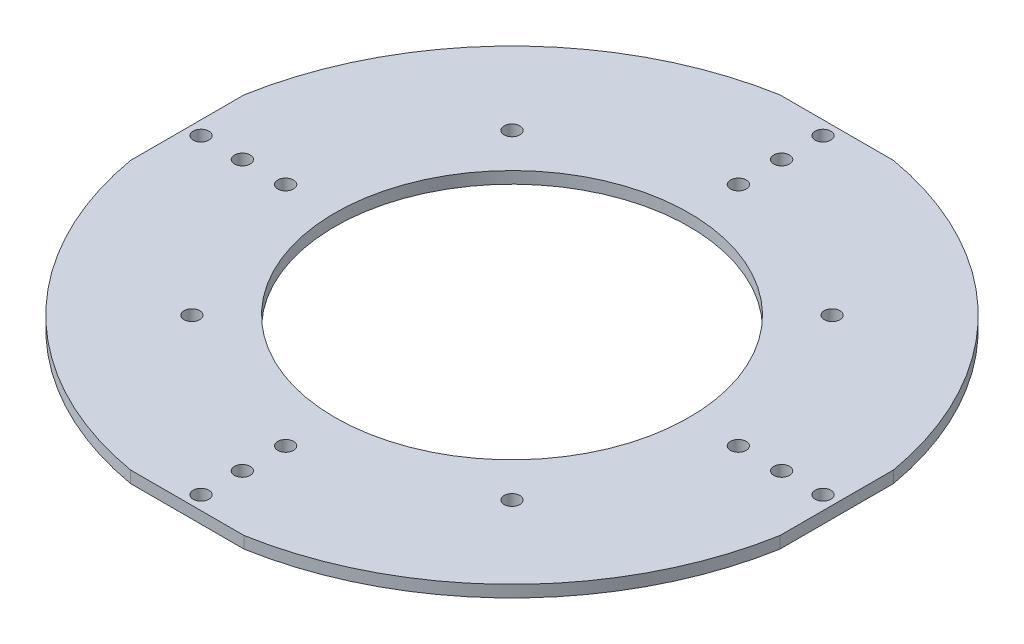
ISO-10303-21;
HEADER;
FILE_DESCRIPTION(('STEP AP214'),'2;1');
FILE_NAME('part.step','',(''),(''),'','','');
FILE_SCHEMA(('AUTOMOTIVE_DESIGN { 1 0 10303 214 1 1 1 1 }'));
ENDSEC;
DATA;
#1=APPLICATION_CONTEXT('core data for automotive mechanical design processes');
#2=APPLICATION_PROTOCOL_DEFINITION('international standard','automotive_design',2000,#1);
#3=PRODUCT_CONTEXT('',#1,'mechanical');
#4=PRODUCT('Part','Part','',(#3));
#5=PRODUCT_RELATED_PRODUCT_CATEGORY('part','',(#4));
#6=PRODUCT_DEFINITION_FORMATION('','',#4);
#7=PRODUCT_DEFINITION_CONTEXT('part definition',#1,'design');
#8=PRODUCT_DEFINITION('design','',#6,#7);
#9=PRODUCT_DEFINITION_SHAPE('','',#8);
#10=(LENGTH_UNIT() NAMED_UNIT(*) SI_UNIT(.MILLI.,.METRE.));
#11=(NAMED_UNIT(*) PLANE_ANGLE_UNIT() SI_UNIT($,.RADIAN.));
#12=(NAMED_UNIT(*) SI_UNIT($,.STERADIAN.) SOLID_ANGLE_UNIT());
#13=UNCERTAINTY_MEASURE_WITH_UNIT(LENGTH_MEASURE(1.E-05),#10,'distance_accuracy_value','');
#14=(GEOMETRIC_REPRESENTATION_CONTEXT(3) GLOBAL_UNCERTAINTY_ASSIGNED_CONTEXT((#13)) GLOBAL_UNIT_ASSIGNED_CONTEXT((#10,
#11,#12)) REPRESENTATION_CONTEXT('',''));
#15=CARTESIAN_POINT('',(0.,0.,0.));
#16=DIRECTION('',(0.,0.,1.));
#17=DIRECTION('',(1.,0.,0.));
#18=AXIS2_PLACEMENT_3D('',#15,#16,#17);
#19=CARTESIAN_POINT('',(0.,6.,0.));
#20=DIRECTION('',(0.,1.,0.));
#21=DIRECTION('',(0.,0.,1.));
#22=AXIS2_PLACEMENT_3D('',#19,#20,#21);
#23=PLANE('',#22);
#24=CARTESIAN_POINT('',(-114.999999999995,6.,4.89538964920655E-12));
#25=DIRECTION('',(0.,1.,0.));
#26=DIRECTION('',(0.,0.,1.));
#27=AXIS2_PLACEMENT_3D('',#24,#25,#26);
#28=CIRCLE('',#27,4.00000000000726);
#29=CARTESIAN_POINT('',(-114.999999999995,6.,4.00000000001216));
#30=VERTEX_POINT('',#29);
#31=EDGE_CURVE('E248',#30,#30,#28,.T.);
#32=ORIENTED_EDGE('',*,*,#31,.F.);
#33=EDGE_LOOP('',(#32));
#34=FACE_BOUND('',#33,.T.);
#35=CARTESIAN_POINT('',(9.76302372279747E-12,6.,115.));
#36=DIRECTION('',(0.,1.,0.));
#37=DIRECTION('',(0.,0.,1.));
#38=AXIS2_PLACEMENT_3D('',#35,#36,#37);
#39=CIRCLE('',#38,4.00000000001011);
#40=CARTESIAN_POINT('',(9.76302372279747E-12,6.,119.00000000001));
#41=VERTEX_POINT('',#40);
#42=EDGE_CURVE('E236',#41,#41,#39,.T.);
#43=ORIENTED_EDGE('',*,*,#42,.F.);
#44=EDGE_LOOP('',(#43));
#45=FACE_BOUND('',#44,.T.);
#46=CARTESIAN_POINT('',(1.64313007644523E-11,6.,158.));
#47=DIRECTION('',(0.,1.,0.));
#48=DIRECTION('',(0.,0.,1.));
#49=AXIS2_PLACEMENT_3D('',#46,#47,#48);
#50=CIRCLE('',#49,4.00000000000875);
#51=CARTESIAN_POINT('',(1.64313007644523E-11,6.,162.000000000009));
#52=VERTEX_POINT('',#51);
#53=EDGE_CURVE('E224',#52,#52,#50,.T.);
#54=ORIENTED_EDGE('',*,*,#53,.F.);
#55=EDGE_LOOP('',(#54));
#56=FACE_BOUND('',#55,.T.);
#57=CARTESIAN_POINT('',(137.,6.,-1.64472998402501E-11));
#58=DIRECTION('',(0.,1.,0.));
#59=DIRECTION('',(0.,0.,1.));
#60=AXIS2_PLACEMENT_3D('',#57,#58,#59);
#61=CIRCLE('',#60,4.00000000000858);
#62=CARTESIAN_POINT('',(137.,6.,3.99999999999214));
#63=VERTEX_POINT('',#62);
#64=EDGE_CURVE('E212',#63,#63,#61,.T.);
#65=ORIENTED_EDGE('',*,*,#64,.F.);
#66=EDGE_LOOP('',(#65));
#67=FACE_BOUND('',#66,.T.);
#68=CARTESIAN_POINT('',(-1.64341523222281E-11,6.,-137.));
#69=DIRECTION('',(0.,1.,0.));
#70=DIRECTION('',(0.,0.,1.));
#71=AXIS2_PLACEMENT_3D('',#68,#69,#70);
#72=CIRCLE('',#71,4.00000000000855);
#73=CARTESIAN_POINT('',(-1.64341523222281E-11,6.,-132.999999999991));
#74=VERTEX_POINT('',#73);
#75=EDGE_CURVE('E200',#74,#74,#72,.T.);
#76=ORIENTED_EDGE('',*,*,#75,.F.);
#77=EDGE_LOOP('',(#76));
#78=FACE_BOUND('',#77,.T.);
#79=CARTESIAN_POINT('',(115.000000000005,6.,-4.88151186139874E-12));
#80=DIRECTION('',(0.,1.,0.));
#81=DIRECTION('',(0.,0.,1.));
#82=AXIS2_PLACEMENT_3D('',#79,#80,#81);
#83=CIRCLE('',#82,4.00000000000362);
#84=CARTESIAN_POINT('',(115.000000000005,6.,3.99999999999874));
#85=VERTEX_POINT('',#84);
#86=EDGE_CURVE('E188',#85,#85,#83,.T.);
#87=ORIENTED_EDGE('',*,*,#86,.F.);
#88=EDGE_LOOP('',(#87));
#89=FACE_BOUND('',#88,.T.);
#90=CARTESIAN_POINT('',(-137.,6.,1.64305221791017E-11));
#91=DIRECTION('',(0.,1.,0.));
#92=DIRECTION('',(0.,0.,1.));
#93=AXIS2_PLACEMENT_3D('',#90,#91,#92);
#94=CIRCLE('',#93,4.00000000000861);
#95=CARTESIAN_POINT('',(-137.,6.,4.00000000002504));
#96=VERTEX_POINT('',#95);
#97=EDGE_CURVE('E176',#96,#96,#94,.T.);
#98=ORIENTED_EDGE('',*,*,#97,.F.);
#99=EDGE_LOOP('',(#98));
#100=FACE_BOUND('',#99,.T.);
#101=CARTESIAN_POINT('',(0.,6.,0.));
#102=DIRECTION('',(0.,1.,0.));
#103=DIRECTION('',(0.,0.,1.));
#104=AXIS2_PLACEMENT_3D('',#101,#102,#103);
#105=CIRCLE('',#104,90.);
#106=CARTESIAN_POINT('',(0.,6.,90.));
#107=VERTEX_POINT('',#106);
#108=EDGE_CURVE('E165',#107,#107,#105,.T.);
#109=ORIENTED_EDGE('',*,*,#108,.F.);
#110=EDGE_LOOP('',(#109));
#111=FACE_BOUND('',#110,.T.);
#112=CARTESIAN_POINT('',(0.,6.,-115.));
#113=DIRECTION('',(0.,1.,0.));
#114=DIRECTION('',(0.,0.,1.));
#115=AXIS2_PLACEMENT_3D('',#112,#113,#114);
#116=CIRCLE('',#115,4.00000000000001);
#117=CARTESIAN_POINT('',(0.,6.,-111.));
#118=VERTEX_POINT('',#117);
#119=EDGE_CURVE('E157',#118,#118,#116,.T.);
#120=ORIENTED_EDGE('',*,*,#119,.F.);
#121=EDGE_LOOP('',(#120));
#122=FACE_BOUND('',#121,.T.);
#123=CARTESIAN_POINT('',(-158.,6.,1.64362167867178E-11));
#124=DIRECTION('',(0.,1.,0.));
#125=DIRECTION('',(0.,0.,1.));
#126=AXIS2_PLACEMENT_3D('',#123,#124,#125);
#127=CIRCLE('',#126,4.00000000000878);
#128=CARTESIAN_POINT('',(-158.,6.,4.00000000002522));
#129=VERTEX_POINT('',#128);
#130=EDGE_CURVE('E170',#129,#129,#127,.T.);
#131=ORIENTED_EDGE('',*,*,#130,.F.);
#132=EDGE_LOOP('',(#131));
#133=FACE_BOUND('',#132,.T.);
#134=CARTESIAN_POINT('',(81.3172798364531,6.,-81.3172798364528));
#135=DIRECTION('',(0.,1.,0.));
#136=DIRECTION('',(0.,0.,1.));
#137=AXIS2_PLACEMENT_3D('',#134,#135,#136);
#138=CIRCLE('',#137,4.00000000000001);
#139=CARTESIAN_POINT('',(81.3172798364531,6.,-77.3172798364528));
#140=VERTEX_POINT('',#139);
#141=EDGE_CURVE('E182',#140,#140,#138,.T.);
#142=ORIENTED_EDGE('',*,*,#141,.F.);
#143=EDGE_LOOP('',(#142));
#144=FACE_BOUND('',#143,.T.);
#145=CARTESIAN_POINT('',(-1.64411328089832E-11,6.,-158.));
#146=DIRECTION('',(0.,1.,0.));
#147=DIRECTION('',(0.,0.,1.));
#148=AXIS2_PLACEMENT_3D('',#145,#146,#147);
#149=CIRCLE('',#148,4.00000000000874);
#150=CARTESIAN_POINT('',(-1.64411328089832E-11,6.,-153.999999999991));
#151=VERTEX_POINT('',#150);
#152=EDGE_CURVE('E194',#151,#151,#149,.T.);
#153=ORIENTED_EDGE('',*,*,#152,.F.);
#154=EDGE_LOOP('',(#153));
#155=FACE_BOUND('',#154,.T.);
#156=CARTESIAN_POINT('',(158.,6.,-1.64555662061443E-11));
#157=DIRECTION('',(0.,1.,0.));
#158=DIRECTION('',(0.,0.,1.));
#159=AXIS2_PLACEMENT_3D('',#156,#157,#158);
#160=CIRCLE('',#159,4.00000000000873);
#161=CARTESIAN_POINT('',(158.,6.,3.99999999999227));
#162=VERTEX_POINT('',#161);
#163=EDGE_CURVE('E206',#162,#162,#160,.T.);
#164=ORIENTED_EDGE('',*,*,#163,.F.);
#165=EDGE_LOOP('',(#164));
#166=FACE_BOUND('',#165,.T.);
#167=CARTESIAN_POINT('',(81.3172798364613,6.,81.3172798364495));
#168=DIRECTION('',(0.,1.,0.));
#169=DIRECTION('',(0.,0.,1.));
#170=AXIS2_PLACEMENT_3D('',#167,#168,#169);
#171=CIRCLE('',#170,4.00000000000755);
#172=CARTESIAN_POINT('',(81.3172798364613,6.,85.3172798364571));
#173=VERTEX_POINT('',#172);
#174=EDGE_CURVE('E218',#173,#173,#171,.T.);
#175=ORIENTED_EDGE('',*,*,#174,.F.);
#176=EDGE_LOOP('',(#175));
#177=FACE_BOUND('',#176,.T.);
#178=CARTESIAN_POINT('',(1.64268920359754E-11,6.,137.));
#179=DIRECTION('',(0.,1.,0.));
#180=DIRECTION('',(0.,0.,1.));
#181=AXIS2_PLACEMENT_3D('',#178,#179,#180);
#182=CIRCLE('',#181,4.00000000000856);
#183=CARTESIAN_POINT('',(1.64268920359754E-11,6.,141.000000000009));
#184=VERTEX_POINT('',#183);
#185=EDGE_CURVE('E230',#184,#184,#182,.T.);
#186=ORIENTED_EDGE('',*,*,#185,.F.);
#187=EDGE_LOOP('',(#186));
#188=FACE_BOUND('',#187,.T.);
#189=CARTESIAN_POINT('',(-81.3172798364446,6.,81.3172798364564));
#190=DIRECTION('',(0.,1.,0.));
#191=DIRECTION('',(0.,0.,1.));
#192=AXIS2_PLACEMENT_3D('',#189,#190,#191);
#193=CIRCLE('',#192,4.00000000000998);
#194=CARTESIAN_POINT('',(-81.3172798364446,6.,85.3172798364664));
#195=VERTEX_POINT('',#194);
#196=EDGE_CURVE('E242',#195,#195,#193,.T.);
#197=ORIENTED_EDGE('',*,*,#196,.F.);
#198=EDGE_LOOP('',(#197));
#199=FACE_BOUND('',#198,.T.);
#200=CARTESIAN_POINT('',(-81.3172798364515,6.,-81.3172798364495));
#201=DIRECTION('',(0.,1.,0.));
#202=DIRECTION('',(0.,0.,1.));
#203=AXIS2_PLACEMENT_3D('',#200,#201,#202);
#204=CIRCLE('',#203,4.00000000000372);
#205=CARTESIAN_POINT('',(-81.3172798364515,6.,-77.3172798364458));
#206=VERTEX_POINT('',#205);
#207=EDGE_CURVE('E254',#206,#206,#204,.T.);
#208=ORIENTED_EDGE('',*,*,#207,.F.);
#209=EDGE_LOOP('',(#208));
#210=FACE_BOUND('',#209,.T.);
#211=CARTESIAN_POINT('',(0.,6.,0.));
#212=DIRECTION('',(0.,1.,0.));
#213=DIRECTION('',(0.,0.,1.));
#214=AXIS2_PLACEMENT_3D('',#211,#212,#213);
#215=CIRCLE('',#214,167.5);
#216=CARTESIAN_POINT('',(28.8314064866772,6.,165.));
#217=VERTEX_POINT('',#216);
#218=CARTESIAN_POINT('',(165.,6.,28.8314064866772));
#219=VERTEX_POINT('',#218);
#220=EDGE_CURVE('E124',#217,#219,#215,.T.);
#221=ORIENTED_EDGE('',*,*,#220,.T.);
#222=DIRECTION('',(0.,0.,-1.));
#223=VECTOR('',#222,1.);
#224=CARTESIAN_POINT('',(165.,6.,165.));
#225=LINE('',#224,#223);
#226=CARTESIAN_POINT('',(165.,6.,-28.8314064866772));
#227=VERTEX_POINT('',#226);
#228=EDGE_CURVE('E110',#219,#227,#225,.T.);
#229=ORIENTED_EDGE('',*,*,#228,.T.);
#230=CARTESIAN_POINT('',(28.8314064866768,6.,-165.));
#231=VERTEX_POINT('',#230);
#232=EDGE_CURVE('E117',#227,#231,#215,.T.);
#233=ORIENTED_EDGE('',*,*,#232,.T.);
#234=DIRECTION('',(-1.,0.,0.));
#235=VECTOR('',#234,1.);
#236=CARTESIAN_POINT('',(-165.,6.,-165.));
#237=LINE('',#236,#235);
#238=CARTESIAN_POINT('',(-28.8314064866768,6.,-165.));
#239=VERTEX_POINT('',#238);
#240=EDGE_CURVE('E100',#231,#239,#237,.T.);
#241=ORIENTED_EDGE('',*,*,#240,.T.);
#242=CARTESIAN_POINT('',(-165.,6.,-28.8314064866768));
#243=VERTEX_POINT('',#242);
#244=EDGE_CURVE('E125',#239,#243,#215,.T.);
#245=ORIENTED_EDGE('',*,*,#244,.T.);
#246=DIRECTION('',(0.,0.,1.));
#247=VECTOR('',#246,1.);
#248=CARTESIAN_POINT('',(-165.,6.,165.));
#249=LINE('',#248,#247);
#250=CARTESIAN_POINT('',(-165.,6.,28.8314064866769));
#251=VERTEX_POINT('',#250);
#252=EDGE_CURVE('E109',#243,#251,#249,.T.);
#253=ORIENTED_EDGE('',*,*,#252,.T.);
#254=CARTESIAN_POINT('',(-28.8314064866772,6.,165.));
#255=VERTEX_POINT('',#254);
#256=EDGE_CURVE('E127',#251,#255,#215,.T.);
#257=ORIENTED_EDGE('',*,*,#256,.T.);
#258=DIRECTION('',(1.,0.,0.));
#259=VECTOR('',#258,1.);
#260=CARTESIAN_POINT('',(-165.,6.,165.));
#261=LINE('',#260,#259);
#262=EDGE_CURVE('E267',#255,#217,#261,.T.);
#263=ORIENTED_EDGE('',*,*,#262,.T.);
#264=EDGE_LOOP('',(#221,#229,#233,#241,#245,#253,#257,#263));
#265=FACE_BOUND('',#264,.T.);
#266=ADVANCED_FACE('F38',(#34,#45,#56,#67,#78,#89,#100,#111,#122,#133,#144,#155,#166,#177,#188,
#199,#210,#265),#23,.T.);
#267=CARTESIAN_POINT('',(0.,0.,0.));
#268=DIRECTION('',(0.,1.,0.));
#269=DIRECTION('',(0.,0.,1.));
#270=AXIS2_PLACEMENT_3D('',#267,#268,#269);
#271=PLANE('',#270);
#272=CARTESIAN_POINT('',(0.,0.,-115.));
#273=DIRECTION('',(0.,1.,0.));
#274=DIRECTION('',(0.,0.,1.));
#275=AXIS2_PLACEMENT_3D('',#272,#273,#274);
#276=CIRCLE('',#275,4.00000000000001);
#277=CARTESIAN_POINT('',(0.,0.,-111.));
#278=VERTEX_POINT('',#277);
#279=EDGE_CURVE('E130',#278,#278,#276,.T.);
#280=ORIENTED_EDGE('',*,*,#279,.T.);
#281=EDGE_LOOP('',(#280));
#282=FACE_BOUND('',#281,.T.);
#283=CARTESIAN_POINT('',(0.,0.,0.));
#284=DIRECTION('',(0.,1.,0.));
#285=DIRECTION('',(0.,0.,1.));
#286=AXIS2_PLACEMENT_3D('',#283,#284,#285);
#287=CIRCLE('',#286,90.);
#288=CARTESIAN_POINT('',(0.,0.,90.));
#289=VERTEX_POINT('',#288);
#290=EDGE_CURVE('E167',#289,#289,#287,.T.);
#291=ORIENTED_EDGE('',*,*,#290,.T.);
#292=EDGE_LOOP('',(#291));
#293=FACE_BOUND('',#292,.T.);
#294=CARTESIAN_POINT('',(-158.,0.,1.64362167867178E-11));
#295=DIRECTION('',(0.,1.,0.));
#296=DIRECTION('',(0.,0.,1.));
#297=AXIS2_PLACEMENT_3D('',#294,#295,#296);
#298=CIRCLE('',#297,4.00000000000878);
#299=CARTESIAN_POINT('',(-158.,0.,4.00000000002522));
#300=VERTEX_POINT('',#299);
#301=EDGE_CURVE('E173',#300,#300,#298,.T.);
#302=ORIENTED_EDGE('',*,*,#301,.T.);
#303=EDGE_LOOP('',(#302));
#304=FACE_BOUND('',#303,.T.);
#305=CARTESIAN_POINT('',(-137.,0.,1.64305221791017E-11));
#306=DIRECTION('',(0.,1.,0.));
#307=DIRECTION('',(0.,0.,1.));
#308=AXIS2_PLACEMENT_3D('',#305,#306,#307);
#309=CIRCLE('',#308,4.00000000000861);
#310=CARTESIAN_POINT('',(-137.,0.,4.00000000002504));
#311=VERTEX_POINT('',#310);
#312=EDGE_CURVE('E179',#311,#311,#309,.T.);
#313=ORIENTED_EDGE('',*,*,#312,.T.);
#314=EDGE_LOOP('',(#313));
#315=FACE_BOUND('',#314,.T.);
#316=CARTESIAN_POINT('',(81.3172798364531,0.,-81.3172798364528));
#317=DIRECTION('',(0.,1.,0.));
#318=DIRECTION('',(0.,0.,1.));
#319=AXIS2_PLACEMENT_3D('',#316,#317,#318);
#320=CIRCLE('',#319,4.00000000000001);
#321=CARTESIAN_POINT('',(81.3172798364531,0.,-77.3172798364528));
#322=VERTEX_POINT('',#321);
#323=EDGE_CURVE('E185',#322,#322,#320,.T.);
#324=ORIENTED_EDGE('',*,*,#323,.T.);
#325=EDGE_LOOP('',(#324));
#326=FACE_BOUND('',#325,.T.);
#327=CARTESIAN_POINT('',(115.000000000005,0.,-4.88151186139874E-12));
#328=DIRECTION('',(0.,1.,0.));
#329=DIRECTION('',(0.,0.,1.));
#330=AXIS2_PLACEMENT_3D('',#327,#328,#329);
#331=CIRCLE('',#330,4.00000000000362);
#332=CARTESIAN_POINT('',(115.000000000005,0.,3.99999999999874));
#333=VERTEX_POINT('',#332);
#334=EDGE_CURVE('E191',#333,#333,#331,.T.);
#335=ORIENTED_EDGE('',*,*,#334,.T.);
#336=EDGE_LOOP('',(#335));
#337=FACE_BOUND('',#336,.T.);
#338=CARTESIAN_POINT('',(-1.64411328089832E-11,0.,-158.));
#339=DIRECTION('',(0.,1.,0.));
#340=DIRECTION('',(0.,0.,1.));
#341=AXIS2_PLACEMENT_3D('',#338,#339,#340);
#342=CIRCLE('',#341,4.00000000000874);
#343=CARTESIAN_POINT('',(-1.64411328089832E-11,0.,-153.999999999991));
#344=VERTEX_POINT('',#343);
#345=EDGE_CURVE('E197',#344,#344,#342,.T.);
#346=ORIENTED_EDGE('',*,*,#345,.T.);
#347=EDGE_LOOP('',(#346));
#348=FACE_BOUND('',#347,.T.);
#349=CARTESIAN_POINT('',(-1.64341523222281E-11,0.,-137.));
#350=DIRECTION('',(0.,1.,0.));
#351=DIRECTION('',(0.,0.,1.));
#352=AXIS2_PLACEMENT_3D('',#349,#350,#351);
#353=CIRCLE('',#352,4.00000000000855);
#354=CARTESIAN_POINT('',(-1.64341523222281E-11,0.,-132.999999999991));
#355=VERTEX_POINT('',#354);
#356=EDGE_CURVE('E203',#355,#355,#353,.T.);
#357=ORIENTED_EDGE('',*,*,#356,.T.);
#358=EDGE_LOOP('',(#357));
#359=FACE_BOUND('',#358,.T.);
#360=CARTESIAN_POINT('',(158.,0.,-1.64555662061443E-11));
#361=DIRECTION('',(0.,1.,0.));
#362=DIRECTION('',(0.,0.,1.));
#363=AXIS2_PLACEMENT_3D('',#360,#361,#362);
#364=CIRCLE('',#363,4.00000000000873);
#365=CARTESIAN_POINT('',(158.,0.,3.99999999999227));
#366=VERTEX_POINT('',#365);
#367=EDGE_CURVE('E209',#366,#366,#364,.T.);
#368=ORIENTED_EDGE('',*,*,#367,.T.);
#369=EDGE_LOOP('',(#368));
#370=FACE_BOUND('',#369,.T.);
#371=CARTESIAN_POINT('',(137.,0.,-1.64472998402501E-11));
#372=DIRECTION('',(0.,1.,0.));
#373=DIRECTION('',(0.,0.,1.));
#374=AXIS2_PLACEMENT_3D('',#371,#372,#373);
#375=CIRCLE('',#374,4.00000000000858);
#376=CARTESIAN_POINT('',(137.,0.,3.99999999999214));
#377=VERTEX_POINT('',#376);
#378=EDGE_CURVE('E215',#377,#377,#375,.T.);
#379=ORIENTED_EDGE('',*,*,#378,.T.);
#380=EDGE_LOOP('',(#379));
#381=FACE_BOUND('',#380,.T.);
#382=CARTESIAN_POINT('',(81.3172798364613,0.,81.3172798364495));
#383=DIRECTION('',(0.,1.,0.));
#384=DIRECTION('',(0.,0.,1.));
#385=AXIS2_PLACEMENT_3D('',#382,#383,#384);
#386=CIRCLE('',#385,4.00000000000755);
#387=CARTESIAN_POINT('',(81.3172798364613,0.,85.3172798364571));
#388=VERTEX_POINT('',#387);
#389=EDGE_CURVE('E221',#388,#388,#386,.T.);
#390=ORIENTED_EDGE('',*,*,#389,.T.);
#391=EDGE_LOOP('',(#390));
#392=FACE_BOUND('',#391,.T.);
#393=CARTESIAN_POINT('',(1.64313007644523E-11,0.,158.));
#394=DIRECTION('',(0.,1.,0.));
#395=DIRECTION('',(0.,0.,1.));
#396=AXIS2_PLACEMENT_3D('',#393,#394,#395);
#397=CIRCLE('',#396,4.00000000000875);
#398=CARTESIAN_POINT('',(1.64313007644523E-11,0.,162.000000000009));
#399=VERTEX_POINT('',#398);
#400=EDGE_CURVE('E227',#399,#399,#397,.T.);
#401=ORIENTED_EDGE('',*,*,#400,.T.);
#402=EDGE_LOOP('',(#401));
#403=FACE_BOUND('',#402,.T.);
#404=CARTESIAN_POINT('',(1.64268920359754E-11,0.,137.));
#405=DIRECTION('',(0.,1.,0.));
#406=DIRECTION('',(0.,0.,1.));
#407=AXIS2_PLACEMENT_3D('',#404,#405,#406);
#408=CIRCLE('',#407,4.00000000000856);
#409=CARTESIAN_POINT('',(1.64268920359754E-11,0.,141.000000000009));
#410=VERTEX_POINT('',#409);
#411=EDGE_CURVE('E233',#410,#410,#408,.T.);
#412=ORIENTED_EDGE('',*,*,#411,.T.);
#413=EDGE_LOOP('',(#412));
#414=FACE_BOUND('',#413,.T.);
#415=CARTESIAN_POINT('',(9.76302372279747E-12,0.,115.));
#416=DIRECTION('',(0.,1.,0.));
#417=DIRECTION('',(0.,0.,1.));
#418=AXIS2_PLACEMENT_3D('',#415,#416,#417);
#419=CIRCLE('',#418,4.00000000001011);
#420=CARTESIAN_POINT('',(9.76302372279747E-12,0.,119.00000000001));
#421=VERTEX_POINT('',#420);
#422=EDGE_CURVE('E239',#421,#421,#419,.T.);
#423=ORIENTED_EDGE('',*,*,#422,.T.);
#424=EDGE_LOOP('',(#423));
#425=FACE_BOUND('',#424,.T.);
#426=CARTESIAN_POINT('',(-81.3172798364446,0.,81.3172798364564));
#427=DIRECTION('',(0.,1.,0.));
#428=DIRECTION('',(0.,0.,1.));
#429=AXIS2_PLACEMENT_3D('',#426,#427,#428);
#430=CIRCLE('',#429,4.00000000000998);
#431=CARTESIAN_POINT('',(-81.3172798364446,0.,85.3172798364664));
#432=VERTEX_POINT('',#431);
#433=EDGE_CURVE('E245',#432,#432,#430,.T.);
#434=ORIENTED_EDGE('',*,*,#433,.T.);
#435=EDGE_LOOP('',(#434));
#436=FACE_BOUND('',#435,.T.);
#437=CARTESIAN_POINT('',(-114.999999999995,0.,4.89538964920655E-12));
#438=DIRECTION('',(0.,1.,0.));
#439=DIRECTION('',(0.,0.,1.));
#440=AXIS2_PLACEMENT_3D('',#437,#438,#439);
#441=CIRCLE('',#440,4.00000000000726);
#442=CARTESIAN_POINT('',(-114.999999999995,0.,4.00000000001216));
#443=VERTEX_POINT('',#442);
#444=EDGE_CURVE('E251',#443,#443,#441,.T.);
#445=ORIENTED_EDGE('',*,*,#444,.T.);
#446=EDGE_LOOP('',(#445));
#447=FACE_BOUND('',#446,.T.);
#448=CARTESIAN_POINT('',(-81.3172798364515,0.,-81.3172798364495));
#449=DIRECTION('',(0.,1.,0.));
#450=DIRECTION('',(0.,0.,1.));
#451=AXIS2_PLACEMENT_3D('',#448,#449,#450);
#452=CIRCLE('',#451,4.00000000000372);
#453=CARTESIAN_POINT('',(-81.3172798364515,0.,-77.3172798364458));
#454=VERTEX_POINT('',#453);
#455=EDGE_CURVE('E257',#454,#454,#452,.T.);
#456=ORIENTED_EDGE('',*,*,#455,.T.);
#457=EDGE_LOOP('',(#456));
#458=FACE_BOUND('',#457,.T.);
#459=DIRECTION('',(0.,0.,-1.));
#460=VECTOR('',#459,1.);
#461=CARTESIAN_POINT('',(165.,0.,0.));
#462=LINE('',#461,#460);
#463=CARTESIAN_POINT('',(165.,0.,28.8314064866772));
#464=VERTEX_POINT('',#463);
#465=CARTESIAN_POINT('',(165.,0.,-28.8314064866772));
#466=VERTEX_POINT('',#465);
#467=EDGE_CURVE('E147',#464,#466,#462,.T.);
#468=ORIENTED_EDGE('',*,*,#467,.F.);
#469=CARTESIAN_POINT('',(0.,0.,0.));
#470=DIRECTION('',(0.,1.,0.));
#471=DIRECTION('',(0.,0.,1.));
#472=AXIS2_PLACEMENT_3D('',#469,#470,#471);
#473=CIRCLE('',#472,167.5);
#474=CARTESIAN_POINT('',(28.8314064866772,0.,165.));
#475=VERTEX_POINT('',#474);
#476=EDGE_CURVE('E132',#475,#464,#473,.T.);
#477=ORIENTED_EDGE('',*,*,#476,.F.);
#478=DIRECTION('',(1.,0.,0.));
#479=VECTOR('',#478,1.);
#480=CARTESIAN_POINT('',(0.,0.,165.));
#481=LINE('',#480,#479);
#482=CARTESIAN_POINT('',(-28.8314064866772,0.,165.));
#483=VERTEX_POINT('',#482);
#484=EDGE_CURVE('E263',#483,#475,#481,.T.);
#485=ORIENTED_EDGE('',*,*,#484,.F.);
#486=CARTESIAN_POINT('',(-165.,0.,28.8314064866769));
#487=VERTEX_POINT('',#486);
#488=EDGE_CURVE('E135',#487,#483,#473,.T.);
#489=ORIENTED_EDGE('',*,*,#488,.F.);
#490=DIRECTION('',(0.,0.,1.));
#491=VECTOR('',#490,1.);
#492=CARTESIAN_POINT('',(-165.,0.,0.));
#493=LINE('',#492,#491);
#494=CARTESIAN_POINT('',(-165.,0.,-28.8314064866768));
#495=VERTEX_POINT('',#494);
#496=EDGE_CURVE('E53',#495,#487,#493,.T.);
#497=ORIENTED_EDGE('',*,*,#496,.F.);
#498=CARTESIAN_POINT('',(-28.8314064866768,0.,-165.));
#499=VERTEX_POINT('',#498);
#500=EDGE_CURVE('E152',#499,#495,#473,.T.);
#501=ORIENTED_EDGE('',*,*,#500,.F.);
#502=DIRECTION('',(-1.,0.,0.));
#503=VECTOR('',#502,1.);
#504=CARTESIAN_POINT('',(0.,0.,-165.));
#505=LINE('',#504,#503);
#506=CARTESIAN_POINT('',(28.8314064866768,0.,-165.));
#507=VERTEX_POINT('',#506);
#508=EDGE_CURVE('E61',#507,#499,#505,.T.);
#509=ORIENTED_EDGE('',*,*,#508,.F.);
#510=EDGE_CURVE('E119',#466,#507,#473,.T.);
#511=ORIENTED_EDGE('',*,*,#510,.F.);
#512=EDGE_LOOP('',(#468,#477,#485,#489,#497,#501,#509,#511));
#513=FACE_BOUND('',#512,.T.);
#514=ADVANCED_FACE('F149',(#282,#293,#304,#315,#326,#337,#348,#359,#370,#381,#392,#403,#414,
#425,#436,#447,#458,#513),#271,.F.);
#515=CARTESIAN_POINT('',(0.,6.,0.));
#516=DIRECTION('',(0.,-1.,0.));
#517=DIRECTION('',(0.,0.,-1.));
#518=AXIS2_PLACEMENT_3D('',#515,#516,#517);
#519=CYLINDRICAL_SURFACE('',#518,167.5);
#520=DIRECTION('',(0.,-1.,0.));
#521=VECTOR('',#520,1.);
#522=CARTESIAN_POINT('',(165.,6.,28.8314064866772));
#523=LINE('',#522,#521);
#524=EDGE_CURVE('E12',#219,#464,#523,.T.);
#525=ORIENTED_EDGE('',*,*,#524,.F.);
#526=ORIENTED_EDGE('',*,*,#220,.F.);
#527=DIRECTION('',(0.,-1.,0.));
#528=VECTOR('',#527,1.);
#529=CARTESIAN_POINT('',(28.8314064866772,6.,165.));
#530=LINE('',#529,#528);
#531=EDGE_CURVE('E140',#475,#217,#530,.F.);
#532=ORIENTED_EDGE('',*,*,#531,.F.);
#533=ORIENTED_EDGE('',*,*,#476,.T.);
#534=EDGE_LOOP('',(#525,#526,#532,#533));
#535=FACE_BOUND('',#534,.T.);
#536=ADVANCED_FACE('F40',(#535),#519,.T.);
#537=DIRECTION('',(0.,-1.,0.));
#538=VECTOR('',#537,1.);
#539=CARTESIAN_POINT('',(165.,6.,-28.8314064866772));
#540=LINE('',#539,#538);
#541=EDGE_CURVE('E46',#466,#227,#540,.F.);
#542=ORIENTED_EDGE('',*,*,#541,.F.);
#543=ORIENTED_EDGE('',*,*,#510,.T.);
#544=DIRECTION('',(0.,-1.,0.));
#545=VECTOR('',#544,1.);
#546=CARTESIAN_POINT('',(28.8314064866768,6.,-165.));
#547=LINE('',#546,#545);
#548=EDGE_CURVE('E103',#231,#507,#547,.T.);
#549=ORIENTED_EDGE('',*,*,#548,.F.);
#550=ORIENTED_EDGE('',*,*,#232,.F.);
#551=EDGE_LOOP('',(#542,#543,#549,#550));
#552=FACE_BOUND('',#551,.T.);
#553=ADVANCED_FACE('F116',(#552),#519,.T.);
#554=DIRECTION('',(0.,-1.,0.));
#555=VECTOR('',#554,1.);
#556=CARTESIAN_POINT('',(-28.8314064866772,6.,165.));
#557=LINE('',#556,#555);
#558=EDGE_CURVE('E142',#255,#483,#557,.T.);
#559=ORIENTED_EDGE('',*,*,#558,.F.);
#560=ORIENTED_EDGE('',*,*,#256,.F.);
#561=DIRECTION('',(0.,-1.,0.));
#562=VECTOR('',#561,1.);
#563=CARTESIAN_POINT('',(-165.,6.,28.8314064866769));
#564=LINE('',#563,#562);
#565=EDGE_CURVE('E120',#487,#251,#564,.F.);
#566=ORIENTED_EDGE('',*,*,#565,.F.);
#567=ORIENTED_EDGE('',*,*,#488,.T.);
#568=EDGE_LOOP('',(#559,#560,#566,#567));
#569=FACE_BOUND('',#568,.T.);
#570=ADVANCED_FACE('F274',(#569),#519,.T.);
#571=DIRECTION('',(0.,-1.,0.));
#572=VECTOR('',#571,1.);
#573=CARTESIAN_POINT('',(-165.,6.,-28.8314064866768));
#574=LINE('',#573,#572);
#575=EDGE_CURVE('E138',#243,#495,#574,.T.);
#576=ORIENTED_EDGE('',*,*,#575,.F.);
#577=ORIENTED_EDGE('',*,*,#244,.F.);
#578=DIRECTION('',(0.,-1.,0.));
#579=VECTOR('',#578,1.);
#580=CARTESIAN_POINT('',(-28.8314064866768,6.,-165.));
#581=LINE('',#580,#579);
#582=EDGE_CURVE('E104',#499,#239,#581,.F.);
#583=ORIENTED_EDGE('',*,*,#582,.F.);
#584=ORIENTED_EDGE('',*,*,#500,.T.);
#585=EDGE_LOOP('',(#576,#577,#583,#584));
#586=FACE_BOUND('',#585,.T.);
#587=ADVANCED_FACE('F282',(#586),#519,.T.);
#588=CARTESIAN_POINT('',(0.,6.,-115.));
#589=DIRECTION('',(0.,-1.,0.));
#590=DIRECTION('',(0.,0.,-1.));
#591=AXIS2_PLACEMENT_3D('',#588,#589,#590);
#592=CYLINDRICAL_SURFACE('',#591,4.00000000000001);
#593=ORIENTED_EDGE('',*,*,#119,.T.);
#594=EDGE_LOOP('',(#593));
#595=FACE_BOUND('',#594,.T.);
#596=ORIENTED_EDGE('',*,*,#279,.F.);
#597=EDGE_LOOP('',(#596));
#598=FACE_BOUND('',#597,.T.);
#599=ADVANCED_FACE('F289',(#595,#598),#592,.F.);
#600=CARTESIAN_POINT('',(0.,6.,0.));
#601=DIRECTION('',(0.,-1.,0.));
#602=DIRECTION('',(0.,0.,-1.));
#603=AXIS2_PLACEMENT_3D('',#600,#601,#602);
#604=CYLINDRICAL_SURFACE('',#603,90.);
#605=ORIENTED_EDGE('',*,*,#108,.T.);
#606=EDGE_LOOP('',(#605));
#607=FACE_BOUND('',#606,.T.);
#608=ORIENTED_EDGE('',*,*,#290,.F.);
#609=EDGE_LOOP('',(#608));
#610=FACE_BOUND('',#609,.T.);
#611=ADVANCED_FACE('F300',(#607,#610),#604,.F.);
#612=CARTESIAN_POINT('',(-158.,6.,1.64362167867178E-11));
#613=DIRECTION('',(0.,-1.,0.));
#614=DIRECTION('',(0.,0.,-1.));
#615=AXIS2_PLACEMENT_3D('',#612,#613,#614);
#616=CYLINDRICAL_SURFACE('',#615,4.00000000000878);
#617=ORIENTED_EDGE('',*,*,#130,.T.);
#618=EDGE_LOOP('',(#617));
#619=FACE_BOUND('',#618,.T.);
#620=ORIENTED_EDGE('',*,*,#301,.F.);
#621=EDGE_LOOP('',(#620));
#622=FACE_BOUND('',#621,.T.);
#623=ADVANCED_FACE('F303',(#619,#622),#616,.F.);
#624=CARTESIAN_POINT('',(-137.,6.,1.64305221791017E-11));
#625=DIRECTION('',(0.,-1.,0.));
#626=DIRECTION('',(0.,0.,-1.));
#627=AXIS2_PLACEMENT_3D('',#624,#625,#626);
#628=CYLINDRICAL_SURFACE('',#627,4.00000000000861);
#629=ORIENTED_EDGE('',*,*,#97,.T.);
#630=EDGE_LOOP('',(#629));
#631=FACE_BOUND('',#630,.T.);
#632=ORIENTED_EDGE('',*,*,#312,.F.);
#633=EDGE_LOOP('',(#632));
#634=FACE_BOUND('',#633,.T.);
#635=ADVANCED_FACE('F307',(#631,#634),#628,.F.);
#636=CARTESIAN_POINT('',(81.3172798364531,6.,-81.3172798364528));
#637=DIRECTION('',(0.,-1.,0.));
#638=DIRECTION('',(0.,0.,-1.));
#639=AXIS2_PLACEMENT_3D('',#636,#637,#638);
#640=CYLINDRICAL_SURFACE('',#639,4.00000000000001);
#641=ORIENTED_EDGE('',*,*,#141,.T.);
#642=EDGE_LOOP('',(#641));
#643=FACE_BOUND('',#642,.T.);
#644=ORIENTED_EDGE('',*,*,#323,.F.);
#645=EDGE_LOOP('',(#644));
#646=FACE_BOUND('',#645,.T.);
#647=ADVANCED_FACE('F311',(#643,#646),#640,.F.);
#648=CARTESIAN_POINT('',(115.000000000005,6.,-4.88151186139874E-12));
#649=DIRECTION('',(0.,-1.,0.));
#650=DIRECTION('',(0.,0.,-1.));
#651=AXIS2_PLACEMENT_3D('',#648,#649,#650);
#652=CYLINDRICAL_SURFACE('',#651,4.00000000000362);
#653=ORIENTED_EDGE('',*,*,#86,.T.);
#654=EDGE_LOOP('',(#653));
#655=FACE_BOUND('',#654,.T.);
#656=ORIENTED_EDGE('',*,*,#334,.F.);
#657=EDGE_LOOP('',(#656));
#658=FACE_BOUND('',#657,.T.);
#659=ADVANCED_FACE('F315',(#655,#658),#652,.F.);
#660=CARTESIAN_POINT('',(-1.64411328089832E-11,6.,-158.));
#661=DIRECTION('',(0.,-1.,0.));
#662=DIRECTION('',(0.,0.,-1.));
#663=AXIS2_PLACEMENT_3D('',#660,#661,#662);
#664=CYLINDRICAL_SURFACE('',#663,4.00000000000874);
#665=ORIENTED_EDGE('',*,*,#152,.T.);
#666=EDGE_LOOP('',(#665));
#667=FACE_BOUND('',#666,.T.);
#668=ORIENTED_EDGE('',*,*,#345,.F.);
#669=EDGE_LOOP('',(#668));
#670=FACE_BOUND('',#669,.T.);
#671=ADVANCED_FACE('F319',(#667,#670),#664,.F.);
#672=CARTESIAN_POINT('',(-1.64341523222281E-11,6.,-137.));
#673=DIRECTION('',(0.,-1.,0.));
#674=DIRECTION('',(0.,0.,-1.));
#675=AXIS2_PLACEMENT_3D('',#672,#673,#674);
#676=CYLINDRICAL_SURFACE('',#675,4.00000000000855);
#677=ORIENTED_EDGE('',*,*,#75,.T.);
#678=EDGE_LOOP('',(#677));
#679=FACE_BOUND('',#678,.T.);
#680=ORIENTED_EDGE('',*,*,#356,.F.);
#681=EDGE_LOOP('',(#680));
#682=FACE_BOUND('',#681,.T.);
#683=ADVANCED_FACE('F323',(#679,#682),#676,.F.);
#684=CARTESIAN_POINT('',(158.,6.,-1.64555662061443E-11));
#685=DIRECTION('',(0.,-1.,0.));
#686=DIRECTION('',(0.,0.,-1.));
#687=AXIS2_PLACEMENT_3D('',#684,#685,#686);
#688=CYLINDRICAL_SURFACE('',#687,4.00000000000873);
#689=ORIENTED_EDGE('',*,*,#163,.T.);
#690=EDGE_LOOP('',(#689));
#691=FACE_BOUND('',#690,.T.);
#692=ORIENTED_EDGE('',*,*,#367,.F.);
#693=EDGE_LOOP('',(#692));
#694=FACE_BOUND('',#693,.T.);
#695=ADVANCED_FACE('F327',(#691,#694),#688,.F.);
#696=CARTESIAN_POINT('',(137.,6.,-1.64472998402501E-11));
#697=DIRECTION('',(0.,-1.,0.));
#698=DIRECTION('',(0.,0.,-1.));
#699=AXIS2_PLACEMENT_3D('',#696,#697,#698);
#700=CYLINDRICAL_SURFACE('',#699,4.00000000000858);
#701=ORIENTED_EDGE('',*,*,#64,.T.);
#702=EDGE_LOOP('',(#701));
#703=FACE_BOUND('',#702,.T.);
#704=ORIENTED_EDGE('',*,*,#378,.F.);
#705=EDGE_LOOP('',(#704));
#706=FACE_BOUND('',#705,.T.);
#707=ADVANCED_FACE('F331',(#703,#706),#700,.F.);
#708=CARTESIAN_POINT('',(81.3172798364613,6.,81.3172798364495));
#709=DIRECTION('',(0.,-1.,0.));
#710=DIRECTION('',(0.,0.,-1.));
#711=AXIS2_PLACEMENT_3D('',#708,#709,#710);
#712=CYLINDRICAL_SURFACE('',#711,4.00000000000755);
#713=ORIENTED_EDGE('',*,*,#174,.T.);
#714=EDGE_LOOP('',(#713));
#715=FACE_BOUND('',#714,.T.);
#716=ORIENTED_EDGE('',*,*,#389,.F.);
#717=EDGE_LOOP('',(#716));
#718=FACE_BOUND('',#717,.T.);
#719=ADVANCED_FACE('F335',(#715,#718),#712,.F.);
#720=CARTESIAN_POINT('',(1.64313007644523E-11,6.,158.));
#721=DIRECTION('',(0.,-1.,0.));
#722=DIRECTION('',(0.,0.,-1.));
#723=AXIS2_PLACEMENT_3D('',#720,#721,#722);
#724=CYLINDRICAL_SURFACE('',#723,4.00000000000875);
#725=ORIENTED_EDGE('',*,*,#53,.T.);
#726=EDGE_LOOP('',(#725));
#727=FACE_BOUND('',#726,.T.);
#728=ORIENTED_EDGE('',*,*,#400,.F.);
#729=EDGE_LOOP('',(#728));
#730=FACE_BOUND('',#729,.T.);
#731=ADVANCED_FACE('F339',(#727,#730),#724,.F.);
#732=CARTESIAN_POINT('',(1.64268920359754E-11,6.,137.));
#733=DIRECTION('',(0.,-1.,0.));
#734=DIRECTION('',(0.,0.,-1.));
#735=AXIS2_PLACEMENT_3D('',#732,#733,#734);
#736=CYLINDRICAL_SURFACE('',#735,4.00000000000856);
#737=ORIENTED_EDGE('',*,*,#185,.T.);
#738=EDGE_LOOP('',(#737));
#739=FACE_BOUND('',#738,.T.);
#740=ORIENTED_EDGE('',*,*,#411,.F.);
#741=EDGE_LOOP('',(#740));
#742=FACE_BOUND('',#741,.T.);
#743=ADVANCED_FACE('F343',(#739,#742),#736,.F.);
#744=CARTESIAN_POINT('',(9.76302372279747E-12,6.,115.));
#745=DIRECTION('',(0.,-1.,0.));
#746=DIRECTION('',(0.,0.,-1.));
#747=AXIS2_PLACEMENT_3D('',#744,#745,#746);
#748=CYLINDRICAL_SURFACE('',#747,4.00000000001011);
#749=ORIENTED_EDGE('',*,*,#42,.T.);
#750=EDGE_LOOP('',(#749));
#751=FACE_BOUND('',#750,.T.);
#752=ORIENTED_EDGE('',*,*,#422,.F.);
#753=EDGE_LOOP('',(#752));
#754=FACE_BOUND('',#753,.T.);
#755=ADVANCED_FACE('F347',(#751,#754),#748,.F.);
#756=CARTESIAN_POINT('',(-81.3172798364446,6.,81.3172798364564));
#757=DIRECTION('',(0.,-1.,0.));
#758=DIRECTION('',(0.,0.,-1.));
#759=AXIS2_PLACEMENT_3D('',#756,#757,#758);
#760=CYLINDRICAL_SURFACE('',#759,4.00000000000998);
#761=ORIENTED_EDGE('',*,*,#196,.T.);
#762=EDGE_LOOP('',(#761));
#763=FACE_BOUND('',#762,.T.);
#764=ORIENTED_EDGE('',*,*,#433,.F.);
#765=EDGE_LOOP('',(#764));
#766=FACE_BOUND('',#765,.T.);
#767=ADVANCED_FACE('F351',(#763,#766),#760,.F.);
#768=CARTESIAN_POINT('',(-114.999999999995,6.,4.89538964920655E-12));
#769=DIRECTION('',(0.,-1.,0.));
#770=DIRECTION('',(0.,0.,-1.));
#771=AXIS2_PLACEMENT_3D('',#768,#769,#770);
#772=CYLINDRICAL_SURFACE('',#771,4.00000000000726);
#773=ORIENTED_EDGE('',*,*,#31,.T.);
#774=EDGE_LOOP('',(#773));
#775=FACE_BOUND('',#774,.T.);
#776=ORIENTED_EDGE('',*,*,#444,.F.);
#777=EDGE_LOOP('',(#776));
#778=FACE_BOUND('',#777,.T.);
#779=ADVANCED_FACE('F355',(#775,#778),#772,.F.);
#780=CARTESIAN_POINT('',(-81.3172798364515,6.,-81.3172798364495));
#781=DIRECTION('',(0.,-1.,0.));
#782=DIRECTION('',(0.,0.,-1.));
#783=AXIS2_PLACEMENT_3D('',#780,#781,#782);
#784=CYLINDRICAL_SURFACE('',#783,4.00000000000372);
#785=ORIENTED_EDGE('',*,*,#207,.T.);
#786=EDGE_LOOP('',(#785));
#787=FACE_BOUND('',#786,.T.);
#788=ORIENTED_EDGE('',*,*,#455,.F.);
#789=EDGE_LOOP('',(#788));
#790=FACE_BOUND('',#789,.T.);
#791=ADVANCED_FACE('F359',(#787,#790),#784,.F.);
#792=CARTESIAN_POINT('',(-165.,-4.,-165.));
#793=DIRECTION('',(0.,0.,-1.));
#794=DIRECTION('',(-1.,0.,0.));
#795=AXIS2_PLACEMENT_3D('',#792,#793,#794);
#796=PLANE('',#795);
#797=ORIENTED_EDGE('',*,*,#548,.T.);
#798=ORIENTED_EDGE('',*,*,#508,.T.);
#799=ORIENTED_EDGE('',*,*,#582,.T.);
#800=ORIENTED_EDGE('',*,*,#240,.F.);
#801=EDGE_LOOP('',(#797,#798,#799,#800));
#802=FACE_BOUND('',#801,.T.);
#803=ADVANCED_FACE('F102',(#802),#796,.T.);
#804=CARTESIAN_POINT('',(-165.,-4.,165.));
#805=DIRECTION('',(-1.,0.,0.));
#806=DIRECTION('',(0.,0.,1.));
#807=AXIS2_PLACEMENT_3D('',#804,#805,#806);
#808=PLANE('',#807);
#809=ORIENTED_EDGE('',*,*,#575,.T.);
#810=ORIENTED_EDGE('',*,*,#496,.T.);
#811=ORIENTED_EDGE('',*,*,#565,.T.);
#812=ORIENTED_EDGE('',*,*,#252,.F.);
#813=EDGE_LOOP('',(#809,#810,#811,#812));
#814=FACE_BOUND('',#813,.T.);
#815=ADVANCED_FACE('F368',(#814),#808,.T.);
#816=CARTESIAN_POINT('',(-165.,-4.,165.));
#817=DIRECTION('',(0.,0.,1.));
#818=DIRECTION('',(1.,0.,0.));
#819=AXIS2_PLACEMENT_3D('',#816,#817,#818);
#820=PLANE('',#819);
#821=ORIENTED_EDGE('',*,*,#558,.T.);
#822=ORIENTED_EDGE('',*,*,#484,.T.);
#823=ORIENTED_EDGE('',*,*,#531,.T.);
#824=ORIENTED_EDGE('',*,*,#262,.F.);
#825=EDGE_LOOP('',(#821,#822,#823,#824));
#826=FACE_BOUND('',#825,.T.);
#827=ADVANCED_FACE('F277',(#826),#820,.T.);
#828=CARTESIAN_POINT('',(165.,-4.,165.));
#829=DIRECTION('',(1.,0.,0.));
#830=DIRECTION('',(0.,0.,-1.));
#831=AXIS2_PLACEMENT_3D('',#828,#829,#830);
#832=PLANE('',#831);
#833=ORIENTED_EDGE('',*,*,#524,.T.);
#834=ORIENTED_EDGE('',*,*,#467,.T.);
#835=ORIENTED_EDGE('',*,*,#541,.T.);
#836=ORIENTED_EDGE('',*,*,#228,.F.);
#837=EDGE_LOOP('',(#833,#834,#835,#836));
#838=FACE_BOUND('',#837,.T.);
#839=ADVANCED_FACE('F144',(#838),#832,.T.);
#840=CLOSED_SHELL('',(#266,#514,#536,#553,#570,#587,#599,#611,#623,#635,#647,#659,#671,#683,
#695,#707,#719,#731,#743,#755,#767,#779,#791,#803,#815,#827,#839));
#841=MANIFOLD_SOLID_BREP('B2',#840);
#842=ADVANCED_BREP_SHAPE_REPRESENTATION('',(#18,#841),#14);
#843=SHAPE_DEFINITION_REPRESENTATION(#9,#842);
ENDSEC;
END-ISO-10303-21;
